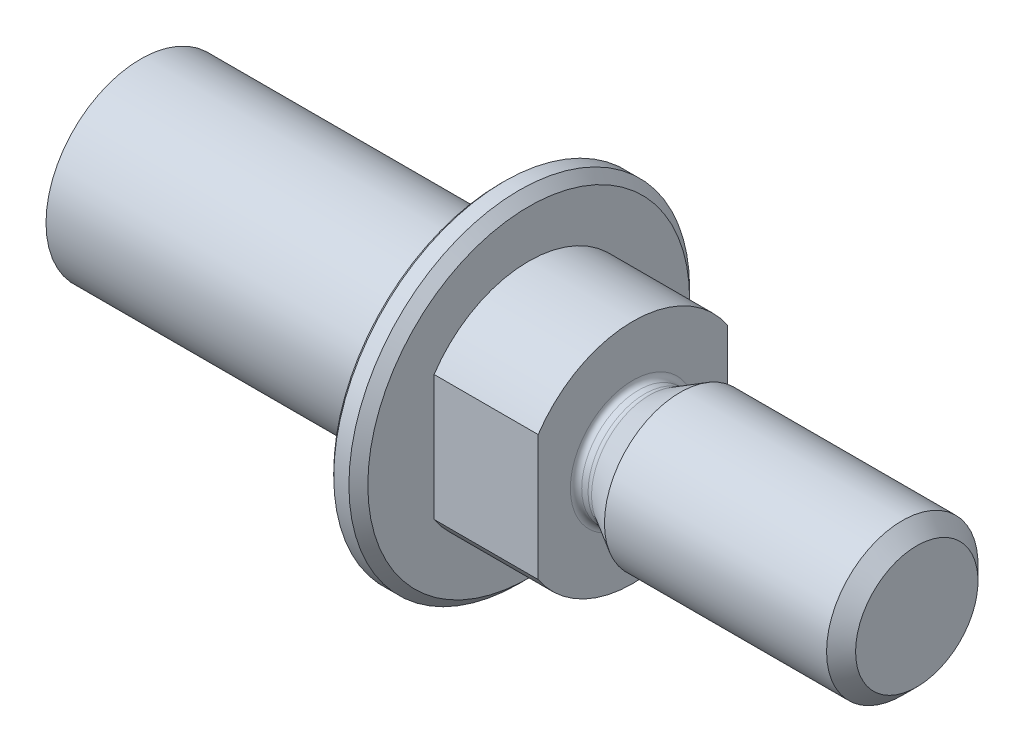
ISO-10303-21;
HEADER;
FILE_DESCRIPTION(('STEP AP214'),'2;1');
FILE_NAME('part.step','',(''),(''),'','','');
FILE_SCHEMA(('AUTOMOTIVE_DESIGN { 1 0 10303 214 1 1 1 1 }'));
ENDSEC;
DATA;
#1=APPLICATION_CONTEXT('core data for automotive mechanical design processes');
#2=APPLICATION_PROTOCOL_DEFINITION('international standard','automotive_design',2000,#1);
#3=PRODUCT_CONTEXT('',#1,'mechanical');
#4=PRODUCT('Part','Part','',(#3));
#5=PRODUCT_RELATED_PRODUCT_CATEGORY('part','',(#4));
#6=PRODUCT_DEFINITION_FORMATION('','',#4);
#7=PRODUCT_DEFINITION_CONTEXT('part definition',#1,'design');
#8=PRODUCT_DEFINITION('design','',#6,#7);
#9=PRODUCT_DEFINITION_SHAPE('','',#8);
#10=(LENGTH_UNIT() NAMED_UNIT(*) SI_UNIT(.MILLI.,.METRE.));
#11=(NAMED_UNIT(*) PLANE_ANGLE_UNIT() SI_UNIT($,.RADIAN.));
#12=(NAMED_UNIT(*) SI_UNIT($,.STERADIAN.) SOLID_ANGLE_UNIT());
#13=UNCERTAINTY_MEASURE_WITH_UNIT(LENGTH_MEASURE(1.E-05),#10,'distance_accuracy_value','');
#14=(GEOMETRIC_REPRESENTATION_CONTEXT(3) GLOBAL_UNCERTAINTY_ASSIGNED_CONTEXT((#13)) GLOBAL_UNIT_ASSIGNED_CONTEXT((#10,
#11,#12)) REPRESENTATION_CONTEXT('',''));
#15=CARTESIAN_POINT('',(0.,0.,0.));
#16=DIRECTION('',(0.,0.,1.));
#17=DIRECTION('',(1.,0.,0.));
#18=AXIS2_PLACEMENT_3D('',#15,#16,#17);
#19=CARTESIAN_POINT('',(260.,0.,0.));
#20=DIRECTION('',(-1.,0.,0.));
#21=DIRECTION('',(0.,0.,1.));
#22=AXIS2_PLACEMENT_3D('',#19,#20,#21);
#23=CYLINDRICAL_SURFACE('',#22,6.);
#24=DIRECTION('',(-1.,0.,0.));
#25=VECTOR('',#24,1.);
#26=CARTESIAN_POINT('',(260.,-3.3166247903554,5.));
#27=LINE('',#26,#25);
#28=CARTESIAN_POINT('',(239.5,-3.3166247903554,5.));
#29=VERTEX_POINT('',#28);
#30=CARTESIAN_POINT('',(245.,-3.3166247903554,5.));
#31=VERTEX_POINT('',#30);
#32=EDGE_CURVE('E32',#29,#31,#27,.F.);
#33=ORIENTED_EDGE('',*,*,#32,.F.);
#34=CARTESIAN_POINT('',(239.5,0.,0.));
#35=DIRECTION('',(-1.,0.,0.));
#36=DIRECTION('',(0.,0.,1.));
#37=AXIS2_PLACEMENT_3D('',#34,#35,#36);
#38=CIRCLE('',#37,6.);
#39=CARTESIAN_POINT('',(239.5,-3.3166247903554,-5.));
#40=VERTEX_POINT('',#39);
#41=EDGE_CURVE('E73',#40,#29,#38,.T.);
#42=ORIENTED_EDGE('',*,*,#41,.F.);
#43=DIRECTION('',(-1.,0.,0.));
#44=VECTOR('',#43,1.);
#45=CARTESIAN_POINT('',(260.,-3.3166247903554,-5.));
#46=LINE('',#45,#44);
#47=CARTESIAN_POINT('',(245.,-3.3166247903554,-5.));
#48=VERTEX_POINT('',#47);
#49=EDGE_CURVE('E58',#48,#40,#46,.T.);
#50=ORIENTED_EDGE('',*,*,#49,.F.);
#51=CARTESIAN_POINT('',(245.,0.,0.));
#52=DIRECTION('',(-1.,0.,0.));
#53=DIRECTION('',(0.,0.,1.));
#54=AXIS2_PLACEMENT_3D('',#51,#52,#53);
#55=CIRCLE('',#54,6.);
#56=EDGE_CURVE('E71',#48,#31,#55,.T.);
#57=ORIENTED_EDGE('',*,*,#56,.T.);
#58=EDGE_LOOP('',(#33,#42,#50,#57));
#59=FACE_BOUND('',#58,.T.);
#60=ADVANCED_FACE('F17',(#59),#23,.T.);
#61=CARTESIAN_POINT('',(238.,0.,0.));
#62=DIRECTION('',(1.,0.,0.));
#63=DIRECTION('',(0.,0.,-1.));
#64=AXIS2_PLACEMENT_3D('',#61,#62,#63);
#65=CONICAL_SURFACE('',#64,8.8,0.785398163397504);
#66=CARTESIAN_POINT('',(238.2,0.,0.));
#67=DIRECTION('',(-1.,0.,0.));
#68=DIRECTION('',(0.,0.,1.));
#69=AXIS2_PLACEMENT_3D('',#66,#67,#68);
#70=CIRCLE('',#69,9.);
#71=CARTESIAN_POINT('',(238.2,0.,9.));
#72=VERTEX_POINT('',#71);
#73=EDGE_CURVE('E10',#72,#72,#70,.T.);
#74=ORIENTED_EDGE('',*,*,#73,.T.);
#75=EDGE_LOOP('',(#74));
#76=FACE_BOUND('',#75,.T.);
#77=CARTESIAN_POINT('',(238.,0.,0.));
#78=DIRECTION('',(-1.,0.,0.));
#79=DIRECTION('',(0.,0.,1.));
#80=AXIS2_PLACEMENT_3D('',#77,#78,#79);
#81=CIRCLE('',#80,8.8);
#82=CARTESIAN_POINT('',(238.,0.,8.8));
#83=VERTEX_POINT('',#82);
#84=EDGE_CURVE('E205',#83,#83,#81,.F.);
#85=ORIENTED_EDGE('',*,*,#84,.T.);
#86=EDGE_LOOP('',(#85));
#87=FACE_BOUND('',#86,.T.);
#88=ADVANCED_FACE('F110',(#76,#87),#65,.T.);
#89=CARTESIAN_POINT('',(260.,0.,0.));
#90=DIRECTION('',(-1.,0.,0.));
#91=DIRECTION('',(0.,0.,1.));
#92=AXIS2_PLACEMENT_3D('',#89,#90,#91);
#93=CYLINDRICAL_SURFACE('',#92,9.);
#94=CARTESIAN_POINT('',(239.,0.,0.));
#95=DIRECTION('',(-1.,0.,0.));
#96=DIRECTION('',(0.,0.,1.));
#97=AXIS2_PLACEMENT_3D('',#94,#95,#96);
#98=CIRCLE('',#97,9.);
#99=CARTESIAN_POINT('',(239.,0.,9.));
#100=VERTEX_POINT('',#99);
#101=EDGE_CURVE('E25',#100,#100,#98,.T.);
#102=ORIENTED_EDGE('',*,*,#101,.T.);
#103=EDGE_LOOP('',(#102));
#104=FACE_BOUND('',#103,.T.);
#105=ORIENTED_EDGE('',*,*,#73,.F.);
#106=EDGE_LOOP('',(#105));
#107=FACE_BOUND('',#106,.T.);
#108=ADVANCED_FACE('F94',(#104,#107),#93,.T.);
#109=CARTESIAN_POINT('',(239.,0.,0.));
#110=DIRECTION('',(-1.,0.,0.));
#111=DIRECTION('',(0.,0.,1.));
#112=AXIS2_PLACEMENT_3D('',#109,#110,#111);
#113=CONICAL_SURFACE('',#112,9.,0.785398163397448);
#114=CARTESIAN_POINT('',(239.5,0.,0.));
#115=DIRECTION('',(-1.,0.,0.));
#116=DIRECTION('',(0.,0.,1.));
#117=AXIS2_PLACEMENT_3D('',#114,#115,#116);
#118=CIRCLE('',#117,8.5);
#119=CARTESIAN_POINT('',(239.5,0.,8.5));
#120=VERTEX_POINT('',#119);
#121=EDGE_CURVE('E89',#120,#120,#118,.T.);
#122=ORIENTED_EDGE('',*,*,#121,.T.);
#123=EDGE_LOOP('',(#122));
#124=FACE_BOUND('',#123,.T.);
#125=ORIENTED_EDGE('',*,*,#101,.F.);
#126=EDGE_LOOP('',(#125));
#127=FACE_BOUND('',#126,.T.);
#128=ADVANCED_FACE('F97',(#124,#127),#113,.T.);
#129=CARTESIAN_POINT('',(239.5,8.5,0.));
#130=DIRECTION('',(1.,0.,0.));
#131=DIRECTION('',(0.,0.,-1.));
#132=AXIS2_PLACEMENT_3D('',#129,#130,#131);
#133=PLANE('',#132);
#134=ORIENTED_EDGE('',*,*,#41,.T.);
#135=DIRECTION('',(0.,1.,0.));
#136=VECTOR('',#135,1.);
#137=CARTESIAN_POINT('',(239.5,-10.,5.));
#138=LINE('',#137,#136);
#139=CARTESIAN_POINT('',(239.5,3.3166247903554,5.));
#140=VERTEX_POINT('',#139);
#141=EDGE_CURVE('E65',#29,#140,#138,.T.);
#142=ORIENTED_EDGE('',*,*,#141,.T.);
#143=CARTESIAN_POINT('',(239.5,3.3166247903554,-5.));
#144=VERTEX_POINT('',#143);
#145=EDGE_CURVE('E86',#140,#144,#38,.T.);
#146=ORIENTED_EDGE('',*,*,#145,.T.);
#147=DIRECTION('',(0.,-1.,0.));
#148=VECTOR('',#147,1.);
#149=CARTESIAN_POINT('',(239.5,10.,-5.));
#150=LINE('',#149,#148);
#151=EDGE_CURVE('E74',#144,#40,#150,.T.);
#152=ORIENTED_EDGE('',*,*,#151,.T.);
#153=EDGE_LOOP('',(#134,#142,#146,#152));
#154=FACE_BOUND('',#153,.T.);
#155=ORIENTED_EDGE('',*,*,#121,.F.);
#156=EDGE_LOOP('',(#155));
#157=FACE_BOUND('',#156,.T.);
#158=ADVANCED_FACE('F99',(#154,#157),#133,.T.);
#159=DIRECTION('',(-1.,0.,0.));
#160=VECTOR('',#159,1.);
#161=CARTESIAN_POINT('',(260.,3.3166247903554,5.));
#162=LINE('',#161,#160);
#163=CARTESIAN_POINT('',(245.,3.3166247903554,5.));
#164=VERTEX_POINT('',#163);
#165=EDGE_CURVE('E127',#164,#140,#162,.T.);
#166=ORIENTED_EDGE('',*,*,#165,.F.);
#167=CARTESIAN_POINT('',(245.,3.3166247903554,-5.));
#168=VERTEX_POINT('',#167);
#169=EDGE_CURVE('E78',#164,#168,#55,.T.);
#170=ORIENTED_EDGE('',*,*,#169,.T.);
#171=DIRECTION('',(-1.,0.,0.));
#172=VECTOR('',#171,1.);
#173=CARTESIAN_POINT('',(260.,3.3166247903554,-5.));
#174=LINE('',#173,#172);
#175=EDGE_CURVE('E40',#144,#168,#174,.F.);
#176=ORIENTED_EDGE('',*,*,#175,.F.);
#177=ORIENTED_EDGE('',*,*,#145,.F.);
#178=EDGE_LOOP('',(#166,#170,#176,#177));
#179=FACE_BOUND('',#178,.T.);
#180=ADVANCED_FACE('F107',(#179),#23,.T.);
#181=CARTESIAN_POINT('',(245.,6.,0.));
#182=DIRECTION('',(1.,0.,0.));
#183=DIRECTION('',(0.,0.,-1.));
#184=AXIS2_PLACEMENT_3D('',#181,#182,#183);
#185=PLANE('',#184);
#186=DIRECTION('',(0.,1.,0.));
#187=VECTOR('',#186,1.);
#188=CARTESIAN_POINT('',(245.,-10.,5.));
#189=LINE('',#188,#187);
#190=EDGE_CURVE('E66',#31,#164,#189,.T.);
#191=ORIENTED_EDGE('',*,*,#190,.F.);
#192=ORIENTED_EDGE('',*,*,#56,.F.);
#193=DIRECTION('',(0.,-1.,0.));
#194=VECTOR('',#193,1.);
#195=CARTESIAN_POINT('',(245.,10.,-5.));
#196=LINE('',#195,#194);
#197=EDGE_CURVE('E55',#168,#48,#196,.T.);
#198=ORIENTED_EDGE('',*,*,#197,.F.);
#199=ORIENTED_EDGE('',*,*,#169,.F.);
#200=EDGE_LOOP('',(#191,#192,#198,#199));
#201=FACE_BOUND('',#200,.T.);
#202=CARTESIAN_POINT('',(245.,0.,0.));
#203=DIRECTION('',(-1.,0.,0.));
#204=DIRECTION('',(0.,0.,1.));
#205=AXIS2_PLACEMENT_3D('',#202,#203,#204);
#206=CIRCLE('',#205,3.3);
#207=CARTESIAN_POINT('',(245.,0.,3.3));
#208=VERTEX_POINT('',#207);
#209=EDGE_CURVE('E79',#208,#208,#206,.T.);
#210=ORIENTED_EDGE('',*,*,#209,.T.);
#211=EDGE_LOOP('',(#210));
#212=FACE_BOUND('',#211,.T.);
#213=ADVANCED_FACE('F76',(#201,#212),#185,.T.);
#214=CARTESIAN_POINT('',(245.299999999993,0.,0.));
#215=DIRECTION('',(-1.,0.,0.));
#216=DIRECTION('',(0.,0.,1.));
#217=AXIS2_PLACEMENT_3D('',#214,#215,#216);
#218=TOROIDAL_SURFACE('',#217,3.29999999999307,0.299999999993076);
#219=CARTESIAN_POINT('',(245.3,0.,0.));
#220=DIRECTION('',(-1.,0.,0.));
#221=DIRECTION('',(0.,0.,1.));
#222=AXIS2_PLACEMENT_3D('',#219,#220,#221);
#223=CIRCLE('',#222,3.);
#224=CARTESIAN_POINT('',(245.3,0.,3.));
#225=VERTEX_POINT('',#224);
#226=EDGE_CURVE('E82',#225,#225,#223,.T.);
#227=ORIENTED_EDGE('',*,*,#226,.T.);
#228=EDGE_LOOP('',(#227));
#229=FACE_BOUND('',#228,.T.);
#230=ORIENTED_EDGE('',*,*,#209,.F.);
#231=EDGE_LOOP('',(#230));
#232=FACE_BOUND('',#231,.T.);
#233=ADVANCED_FACE('F124',(#229,#232),#218,.F.);
#234=CARTESIAN_POINT('',(260.,0.,0.));
#235=DIRECTION('',(-1.,0.,0.));
#236=DIRECTION('',(0.,0.,1.));
#237=AXIS2_PLACEMENT_3D('',#234,#235,#236);
#238=CYLINDRICAL_SURFACE('',#237,3.);
#239=CARTESIAN_POINT('',(245.63397459622,0.,0.));
#240=DIRECTION('',(-1.,0.,0.));
#241=DIRECTION('',(0.,0.,1.));
#242=AXIS2_PLACEMENT_3D('',#239,#240,#241);
#243=CIRCLE('',#242,3.);
#244=CARTESIAN_POINT('',(245.63397459622,0.,3.));
#245=VERTEX_POINT('',#244);
#246=EDGE_CURVE('E145',#245,#245,#243,.T.);
#247=ORIENTED_EDGE('',*,*,#246,.T.);
#248=EDGE_LOOP('',(#247));
#249=FACE_BOUND('',#248,.T.);
#250=ORIENTED_EDGE('',*,*,#226,.F.);
#251=EDGE_LOOP('',(#250));
#252=FACE_BOUND('',#251,.T.);
#253=ADVANCED_FACE('F152',(#249,#252),#238,.T.);
#254=CARTESIAN_POINT('',(245.633974596217,0.,0.));
#255=DIRECTION('',(-1.,0.,0.));
#256=DIRECTION('',(0.,0.,1.));
#257=AXIS2_PLACEMENT_3D('',#254,#255,#256);
#258=TOROIDAL_SURFACE('',#257,3.50000000000999,0.500000000009988);
#259=CARTESIAN_POINT('',(245.88397459622,0.,0.));
#260=DIRECTION('',(-1.,0.,0.));
#261=DIRECTION('',(0.,0.,1.));
#262=AXIS2_PLACEMENT_3D('',#259,#260,#261);
#263=CIRCLE('',#262,3.0669872981078);
#264=CARTESIAN_POINT('',(245.88397459622,0.,3.0669872981078));
#265=VERTEX_POINT('',#264);
#266=EDGE_CURVE('E142',#265,#265,#263,.T.);
#267=ORIENTED_EDGE('',*,*,#266,.T.);
#268=EDGE_LOOP('',(#267));
#269=FACE_BOUND('',#268,.T.);
#270=ORIENTED_EDGE('',*,*,#246,.F.);
#271=EDGE_LOOP('',(#270));
#272=FACE_BOUND('',#271,.T.);
#273=ADVANCED_FACE('F154',(#269,#272),#258,.F.);
#274=CARTESIAN_POINT('',(245.88397459622,0.,0.));
#275=DIRECTION('',(1.,0.,0.));
#276=DIRECTION('',(0.,0.,-1.));
#277=AXIS2_PLACEMENT_3D('',#274,#275,#276);
#278=CONICAL_SURFACE('',#277,3.0669872981078,0.523598775599485);
#279=CARTESIAN_POINT('',(247.5,0.,0.));
#280=DIRECTION('',(-1.,0.,0.));
#281=DIRECTION('',(0.,0.,1.));
#282=AXIS2_PLACEMENT_3D('',#279,#280,#281);
#283=CIRCLE('',#282,4.);
#284=CARTESIAN_POINT('',(247.5,0.,4.));
#285=VERTEX_POINT('',#284);
#286=EDGE_CURVE('E139',#285,#285,#283,.T.);
#287=ORIENTED_EDGE('',*,*,#286,.T.);
#288=EDGE_LOOP('',(#287));
#289=FACE_BOUND('',#288,.T.);
#290=ORIENTED_EDGE('',*,*,#266,.F.);
#291=EDGE_LOOP('',(#290));
#292=FACE_BOUND('',#291,.T.);
#293=ADVANCED_FACE('F161',(#289,#292),#278,.T.);
#294=CARTESIAN_POINT('',(260.,0.,0.));
#295=DIRECTION('',(-1.,0.,0.));
#296=DIRECTION('',(0.,0.,1.));
#297=AXIS2_PLACEMENT_3D('',#294,#295,#296);
#298=CYLINDRICAL_SURFACE('',#297,4.);
#299=CARTESIAN_POINT('',(259.233,0.,0.));
#300=DIRECTION('',(-1.,0.,0.));
#301=DIRECTION('',(0.,0.,1.));
#302=AXIS2_PLACEMENT_3D('',#299,#300,#301);
#303=CIRCLE('',#302,4.);
#304=CARTESIAN_POINT('',(259.233,0.,4.));
#305=VERTEX_POINT('',#304);
#306=EDGE_CURVE('E136',#305,#305,#303,.T.);
#307=ORIENTED_EDGE('',*,*,#306,.T.);
#308=EDGE_LOOP('',(#307));
#309=FACE_BOUND('',#308,.T.);
#310=ORIENTED_EDGE('',*,*,#286,.F.);
#311=EDGE_LOOP('',(#310));
#312=FACE_BOUND('',#311,.T.);
#313=ADVANCED_FACE('F168',(#309,#312),#298,.T.);
#314=CARTESIAN_POINT('',(259.233,0.,0.));
#315=DIRECTION('',(-1.,0.,0.));
#316=DIRECTION('',(0.,0.,1.));
#317=AXIS2_PLACEMENT_3D('',#314,#315,#316);
#318=CONICAL_SURFACE('',#317,4.,0.785398163397436);
#319=CARTESIAN_POINT('',(260.,0.,0.));
#320=DIRECTION('',(-1.,0.,0.));
#321=DIRECTION('',(0.,0.,1.));
#322=AXIS2_PLACEMENT_3D('',#319,#320,#321);
#323=CIRCLE('',#322,3.233);
#324=CARTESIAN_POINT('',(260.,0.,3.233));
#325=VERTEX_POINT('',#324);
#326=EDGE_CURVE('E130',#325,#325,#323,.T.);
#327=ORIENTED_EDGE('',*,*,#326,.T.);
#328=EDGE_LOOP('',(#327));
#329=FACE_BOUND('',#328,.T.);
#330=ORIENTED_EDGE('',*,*,#306,.F.);
#331=EDGE_LOOP('',(#330));
#332=FACE_BOUND('',#331,.T.);
#333=ADVANCED_FACE('F172',(#329,#332),#318,.T.);
#334=CARTESIAN_POINT('',(260.,3.233,0.));
#335=DIRECTION('',(1.,0.,0.));
#336=DIRECTION('',(0.,0.,-1.));
#337=AXIS2_PLACEMENT_3D('',#334,#335,#336);
#338=PLANE('',#337);
#339=ORIENTED_EDGE('',*,*,#326,.F.);
#340=EDGE_LOOP('',(#339));
#341=FACE_BOUND('',#340,.T.);
#342=ADVANCED_FACE('F176',(#341),#338,.T.);
#343=CARTESIAN_POINT('',(239.5,10.,-5.));
#344=DIRECTION('',(0.,0.,1.));
#345=DIRECTION('',(1.,0.,0.));
#346=AXIS2_PLACEMENT_3D('',#343,#344,#345);
#347=PLANE('',#346);
#348=ORIENTED_EDGE('',*,*,#175,.T.);
#349=ORIENTED_EDGE('',*,*,#197,.T.);
#350=ORIENTED_EDGE('',*,*,#49,.T.);
#351=ORIENTED_EDGE('',*,*,#151,.F.);
#352=EDGE_LOOP('',(#348,#349,#350,#351));
#353=FACE_BOUND('',#352,.T.);
#354=ADVANCED_FACE('F57',(#353),#347,.F.);
#355=CARTESIAN_POINT('',(239.5,-10.,5.));
#356=DIRECTION('',(0.,0.,-1.));
#357=DIRECTION('',(-1.,0.,0.));
#358=AXIS2_PLACEMENT_3D('',#355,#356,#357);
#359=PLANE('',#358);
#360=ORIENTED_EDGE('',*,*,#32,.T.);
#361=ORIENTED_EDGE('',*,*,#190,.T.);
#362=ORIENTED_EDGE('',*,*,#165,.T.);
#363=ORIENTED_EDGE('',*,*,#141,.F.);
#364=EDGE_LOOP('',(#360,#361,#362,#363));
#365=FACE_BOUND('',#364,.T.);
#366=ADVANCED_FACE('F181',(#365),#359,.F.);
#367=CARTESIAN_POINT('',(238.,0.,0.));
#368=DIRECTION('',(-1.,0.,0.));
#369=DIRECTION('',(0.,0.,1.));
#370=AXIS2_PLACEMENT_3D('',#367,#368,#369);
#371=PLANE('',#370);
#372=ORIENTED_EDGE('',*,*,#84,.F.);
#373=EDGE_LOOP('',(#372));
#374=FACE_BOUND('',#373,.T.);
#375=CARTESIAN_POINT('',(238.,0.,0.));
#376=DIRECTION('',(-1.,0.,0.));
#377=DIRECTION('',(0.,0.,1.));
#378=AXIS2_PLACEMENT_3D('',#375,#376,#377);
#379=CIRCLE('',#378,5.);
#380=CARTESIAN_POINT('',(238.,0.,5.));
#381=VERTEX_POINT('',#380);
#382=EDGE_CURVE('E200',#381,#381,#379,.T.);
#383=ORIENTED_EDGE('',*,*,#382,.F.);
#384=EDGE_LOOP('',(#383));
#385=FACE_BOUND('',#384,.T.);
#386=ADVANCED_FACE('F184',(#374,#385),#371,.T.);
#387=CARTESIAN_POINT('',(238.,0.,0.));
#388=DIRECTION('',(-1.,0.,0.));
#389=DIRECTION('',(0.,0.,1.));
#390=AXIS2_PLACEMENT_3D('',#387,#388,#389);
#391=CYLINDRICAL_SURFACE('',#390,5.);
#392=ORIENTED_EDGE('',*,*,#382,.T.);
#393=EDGE_LOOP('',(#392));
#394=FACE_BOUND('',#393,.T.);
#395=CARTESIAN_POINT('',(219.,0.,0.));
#396=DIRECTION('',(-1.,0.,0.));
#397=DIRECTION('',(0.,0.,1.));
#398=AXIS2_PLACEMENT_3D('',#395,#396,#397);
#399=CIRCLE('',#398,5.);
#400=CARTESIAN_POINT('',(219.,0.,5.));
#401=VERTEX_POINT('',#400);
#402=EDGE_CURVE('E203',#401,#401,#399,.T.);
#403=ORIENTED_EDGE('',*,*,#402,.F.);
#404=EDGE_LOOP('',(#403));
#405=FACE_BOUND('',#404,.T.);
#406=ADVANCED_FACE('F189',(#394,#405),#391,.T.);
#407=CARTESIAN_POINT('',(219.,0.,0.));
#408=DIRECTION('',(-1.,0.,0.));
#409=DIRECTION('',(0.,0.,1.));
#410=AXIS2_PLACEMENT_3D('',#407,#408,#409);
#411=PLANE('',#410);
#412=ORIENTED_EDGE('',*,*,#402,.T.);
#413=EDGE_LOOP('',(#412));
#414=FACE_BOUND('',#413,.T.);
#415=ADVANCED_FACE('F19',(#414),#411,.T.);
#416=CLOSED_SHELL('',(#60,#88,#108,#128,#158,#180,#213,#233,#253,#273,#293,#313,#333,#342,#354,
#366,#386,#406,#415));
#417=MANIFOLD_SOLID_BREP('B1',#416);
#418=ADVANCED_BREP_SHAPE_REPRESENTATION('',(#18,#417),#14);
#419=SHAPE_DEFINITION_REPRESENTATION(#9,#418);
ENDSEC;
END-ISO-10303-21;
